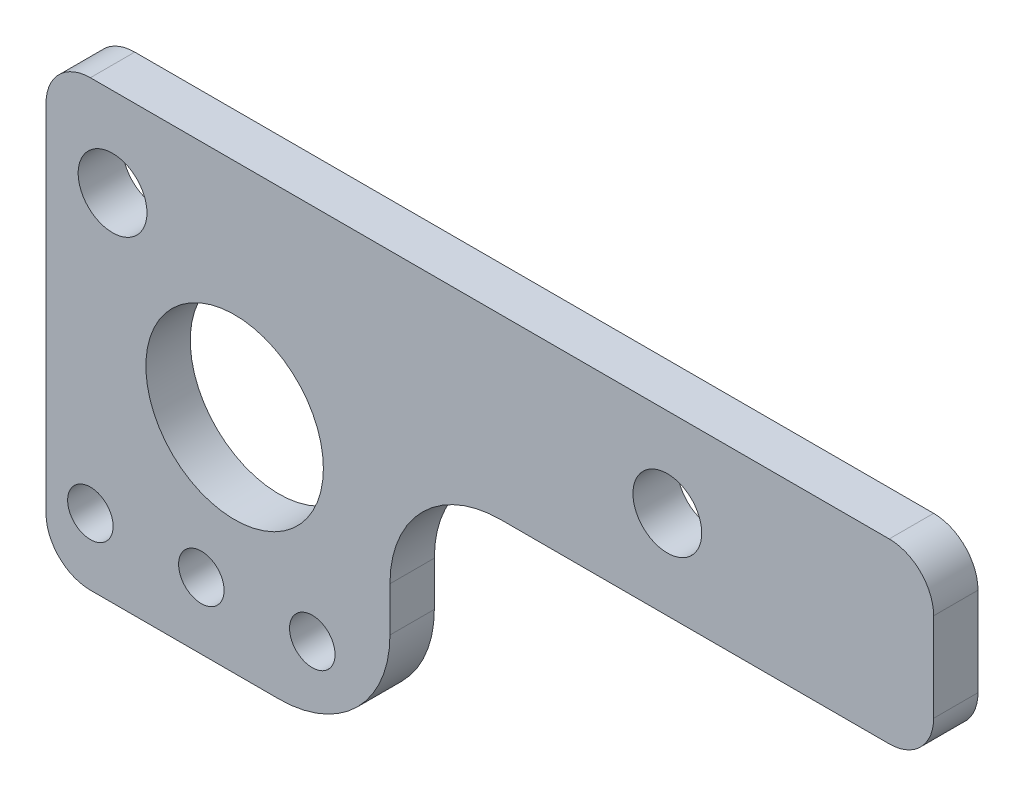
ISO-10303-21;
HEADER;
FILE_DESCRIPTION(('STEP AP214'),'2;1');
FILE_NAME('part.step','',(''),(''),'','','');
FILE_SCHEMA(('AUTOMOTIVE_DESIGN { 1 0 10303 214 1 1 1 1 }'));
ENDSEC;
DATA;
#1=APPLICATION_CONTEXT('core data for automotive mechanical design processes');
#2=APPLICATION_PROTOCOL_DEFINITION('international standard','automotive_design',2000,#1);
#3=PRODUCT_CONTEXT('',#1,'mechanical');
#4=PRODUCT('Part','Part','',(#3));
#5=PRODUCT_RELATED_PRODUCT_CATEGORY('part','',(#4));
#6=PRODUCT_DEFINITION_FORMATION('','',#4);
#7=PRODUCT_DEFINITION_CONTEXT('part definition',#1,'design');
#8=PRODUCT_DEFINITION('design','',#6,#7);
#9=PRODUCT_DEFINITION_SHAPE('','',#8);
#10=(LENGTH_UNIT() NAMED_UNIT(*) SI_UNIT(.MILLI.,.METRE.));
#11=(NAMED_UNIT(*) PLANE_ANGLE_UNIT() SI_UNIT($,.RADIAN.));
#12=(NAMED_UNIT(*) SI_UNIT($,.STERADIAN.) SOLID_ANGLE_UNIT());
#13=UNCERTAINTY_MEASURE_WITH_UNIT(LENGTH_MEASURE(1.E-05),#10,'distance_accuracy_value','');
#14=(GEOMETRIC_REPRESENTATION_CONTEXT(3) GLOBAL_UNCERTAINTY_ASSIGNED_CONTEXT((#13)) GLOBAL_UNIT_ASSIGNED_CONTEXT((#10,
#11,#12)) REPRESENTATION_CONTEXT('',''));
#15=CARTESIAN_POINT('',(0.,0.,0.));
#16=DIRECTION('',(0.,0.,1.));
#17=DIRECTION('',(1.,0.,0.));
#18=AXIS2_PLACEMENT_3D('',#15,#16,#17);
#19=CARTESIAN_POINT('',(-15.5,-4.,2.));
#20=DIRECTION('',(0.,1.,0.));
#21=DIRECTION('',(-1.,0.,0.));
#22=AXIS2_PLACEMENT_3D('',#19,#20,#21);
#23=PLANE('',#22);
#24=DIRECTION('',(1.,0.,0.));
#25=VECTOR('',#24,1.);
#26=CARTESIAN_POINT('',(-15.5,-4.,2.));
#27=LINE('',#26,#25);
#28=CARTESIAN_POINT('',(5.,-4.,2.));
#29=VERTEX_POINT('',#28);
#30=CARTESIAN_POINT('',(22.5,-4.,2.));
#31=VERTEX_POINT('',#30);
#32=EDGE_CURVE('E252',#29,#31,#27,.T.);
#33=ORIENTED_EDGE('',*,*,#32,.F.);
#34=DIRECTION('',(0.,0.,1.));
#35=VECTOR('',#34,1.);
#36=CARTESIAN_POINT('',(5.,-4.,2.));
#37=LINE('',#36,#35);
#38=CARTESIAN_POINT('',(5.,-4.,0.));
#39=VERTEX_POINT('',#38);
#40=EDGE_CURVE('E54',#29,#39,#37,.F.);
#41=ORIENTED_EDGE('',*,*,#40,.T.);
#42=DIRECTION('',(1.,0.,0.));
#43=VECTOR('',#42,1.);
#44=CARTESIAN_POINT('',(-15.5,-4.,0.));
#45=LINE('',#44,#43);
#46=CARTESIAN_POINT('',(22.5,-4.,0.));
#47=VERTEX_POINT('',#46);
#48=EDGE_CURVE('E178',#39,#47,#45,.T.);
#49=ORIENTED_EDGE('',*,*,#48,.T.);
#50=DIRECTION('',(0.,0.,1.));
#51=VECTOR('',#50,1.);
#52=CARTESIAN_POINT('',(22.5,-4.,2.));
#53=LINE('',#52,#51);
#54=EDGE_CURVE('E185',#47,#31,#53,.T.);
#55=ORIENTED_EDGE('',*,*,#54,.T.);
#56=EDGE_LOOP('',(#33,#41,#49,#55));
#57=FACE_BOUND('',#56,.T.);
#58=ADVANCED_FACE('F39',(#57),#23,.F.);
#59=CARTESIAN_POINT('',(-15.5,4.,2.));
#60=DIRECTION('',(0.,-1.,0.));
#61=DIRECTION('',(1.,0.,0.));
#62=AXIS2_PLACEMENT_3D('',#59,#60,#61);
#63=PLANE('',#62);
#64=DIRECTION('',(-1.,0.,0.));
#65=VECTOR('',#64,1.);
#66=CARTESIAN_POINT('',(-15.5,4.,2.));
#67=LINE('',#66,#65);
#68=CARTESIAN_POINT('',(22.5,4.,2.));
#69=VERTEX_POINT('',#68);
#70=CARTESIAN_POINT('',(-13.5,4.,2.));
#71=VERTEX_POINT('',#70);
#72=EDGE_CURVE('E184',#69,#71,#67,.T.);
#73=ORIENTED_EDGE('',*,*,#72,.F.);
#74=DIRECTION('',(0.,0.,1.));
#75=VECTOR('',#74,1.);
#76=CARTESIAN_POINT('',(22.5,4.,0.));
#77=LINE('',#76,#75);
#78=CARTESIAN_POINT('',(22.5,4.,0.));
#79=VERTEX_POINT('',#78);
#80=EDGE_CURVE('E272',#69,#79,#77,.F.);
#81=ORIENTED_EDGE('',*,*,#80,.T.);
#82=DIRECTION('',(-1.,0.,0.));
#83=VECTOR('',#82,1.);
#84=CARTESIAN_POINT('',(-15.5,4.,0.));
#85=LINE('',#84,#83);
#86=CARTESIAN_POINT('',(-13.5,4.,0.));
#87=VERTEX_POINT('',#86);
#88=EDGE_CURVE('E179',#79,#87,#85,.T.);
#89=ORIENTED_EDGE('',*,*,#88,.T.);
#90=DIRECTION('',(0.,0.,-1.));
#91=VECTOR('',#90,1.);
#92=CARTESIAN_POINT('',(-13.5,4.,2.));
#93=LINE('',#92,#91);
#94=EDGE_CURVE('E274',#87,#71,#93,.F.);
#95=ORIENTED_EDGE('',*,*,#94,.T.);
#96=EDGE_LOOP('',(#73,#81,#89,#95));
#97=FACE_BOUND('',#96,.T.);
#98=ADVANCED_FACE('F312',(#97),#63,.F.);
#99=CARTESIAN_POINT('',(-15.5,-4.,2.));
#100=DIRECTION('',(1.,0.,0.));
#101=DIRECTION('',(0.,0.,-1.));
#102=AXIS2_PLACEMENT_3D('',#99,#100,#101);
#103=PLANE('',#102);
#104=DIRECTION('',(0.,-1.,0.));
#105=VECTOR('',#104,1.);
#106=CARTESIAN_POINT('',(-15.5,-4.,0.));
#107=LINE('',#106,#105);
#108=CARTESIAN_POINT('',(-15.5,2.,0.));
#109=VERTEX_POINT('',#108);
#110=CARTESIAN_POINT('',(-15.5,-14.,0.));
#111=VERTEX_POINT('',#110);
#112=EDGE_CURVE('E174',#109,#111,#107,.T.);
#113=ORIENTED_EDGE('',*,*,#112,.T.);
#114=DIRECTION('',(0.,0.,1.));
#115=VECTOR('',#114,1.);
#116=CARTESIAN_POINT('',(-15.5,-14.,2.));
#117=LINE('',#116,#115);
#118=CARTESIAN_POINT('',(-15.5,-14.,2.));
#119=VERTEX_POINT('',#118);
#120=EDGE_CURVE('E154',#111,#119,#117,.T.);
#121=ORIENTED_EDGE('',*,*,#120,.T.);
#122=DIRECTION('',(0.,-1.,0.));
#123=VECTOR('',#122,1.);
#124=CARTESIAN_POINT('',(-15.5,-4.,2.));
#125=LINE('',#124,#123);
#126=CARTESIAN_POINT('',(-15.5,2.,2.));
#127=VERTEX_POINT('',#126);
#128=EDGE_CURVE('E260',#127,#119,#125,.T.);
#129=ORIENTED_EDGE('',*,*,#128,.F.);
#130=DIRECTION('',(0.,0.,-1.));
#131=VECTOR('',#130,1.);
#132=CARTESIAN_POINT('',(-15.5,2.,2.));
#133=LINE('',#132,#131);
#134=EDGE_CURVE('E269',#127,#109,#133,.T.);
#135=ORIENTED_EDGE('',*,*,#134,.T.);
#136=EDGE_LOOP('',(#113,#121,#129,#135));
#137=FACE_BOUND('',#136,.T.);
#138=ADVANCED_FACE('F303',(#137),#103,.F.);
#139=CARTESIAN_POINT('',(0.,0.,2.));
#140=DIRECTION('',(0.,0.,-1.));
#141=DIRECTION('',(-1.,0.,0.));
#142=AXIS2_PLACEMENT_3D('',#139,#140,#141);
#143=PLANE('',#142);
#144=CARTESIAN_POINT('',(-7.,-6.,2.));
#145=DIRECTION('',(0.,0.,1.));
#146=DIRECTION('',(1.,0.,0.));
#147=AXIS2_PLACEMENT_3D('',#144,#145,#146);
#148=CIRCLE('',#147,4.);
#149=CARTESIAN_POINT('',(-3.,-6.,2.));
#150=VERTEX_POINT('',#149);
#151=EDGE_CURVE('E226',#150,#150,#148,.T.);
#152=ORIENTED_EDGE('',*,*,#151,.F.);
#153=EDGE_LOOP('',(#152));
#154=FACE_BOUND('',#153,.T.);
#155=DIRECTION('',(1.,0.,0.));
#156=VECTOR('',#155,1.);
#157=CARTESIAN_POINT('',(0.,-16.,2.));
#158=LINE('',#157,#156);
#159=CARTESIAN_POINT('',(-13.5,-16.,2.));
#160=VERTEX_POINT('',#159);
#161=CARTESIAN_POINT('',(-5.,-16.,2.));
#162=VERTEX_POINT('',#161);
#163=EDGE_CURVE('E135',#160,#162,#158,.T.);
#164=ORIENTED_EDGE('',*,*,#163,.T.);
#165=CARTESIAN_POINT('',(-5.,-11.,2.));
#166=DIRECTION('',(0.,0.,-1.));
#167=DIRECTION('',(-1.,0.,0.));
#168=AXIS2_PLACEMENT_3D('',#165,#166,#167);
#169=CIRCLE('',#168,5.);
#170=CARTESIAN_POINT('',(0.,-11.,2.));
#171=VERTEX_POINT('',#170);
#172=EDGE_CURVE('E263',#162,#171,#169,.F.);
#173=ORIENTED_EDGE('',*,*,#172,.T.);
#174=DIRECTION('',(0.,1.,0.));
#175=VECTOR('',#174,1.);
#176=CARTESIAN_POINT('',(0.,-4.,2.));
#177=LINE('',#176,#175);
#178=CARTESIAN_POINT('',(0.,-9.,2.));
#179=VERTEX_POINT('',#178);
#180=EDGE_CURVE('E149',#171,#179,#177,.T.);
#181=ORIENTED_EDGE('',*,*,#180,.T.);
#182=CARTESIAN_POINT('',(5.,-9.,2.));
#183=DIRECTION('',(0.,0.,-1.));
#184=DIRECTION('',(-1.,0.,0.));
#185=AXIS2_PLACEMENT_3D('',#182,#183,#184);
#186=CIRCLE('',#185,5.);
#187=EDGE_CURVE('E47',#179,#29,#186,.T.);
#188=ORIENTED_EDGE('',*,*,#187,.T.);
#189=ORIENTED_EDGE('',*,*,#32,.T.);
#190=CARTESIAN_POINT('',(22.5,-2.,2.));
#191=DIRECTION('',(0.,0.,-1.));
#192=DIRECTION('',(-1.,0.,0.));
#193=AXIS2_PLACEMENT_3D('',#190,#191,#192);
#194=CIRCLE('',#193,2.);
#195=CARTESIAN_POINT('',(24.5,-2.,2.));
#196=VERTEX_POINT('',#195);
#197=EDGE_CURVE('E283',#31,#196,#194,.F.);
#198=ORIENTED_EDGE('',*,*,#197,.T.);
#199=DIRECTION('',(0.,1.,0.));
#200=VECTOR('',#199,1.);
#201=CARTESIAN_POINT('',(24.5,4.,2.));
#202=LINE('',#201,#200);
#203=CARTESIAN_POINT('',(24.5,2.,2.));
#204=VERTEX_POINT('',#203);
#205=EDGE_CURVE('E139',#196,#204,#202,.T.);
#206=ORIENTED_EDGE('',*,*,#205,.T.);
#207=CARTESIAN_POINT('',(22.5,2.,2.));
#208=DIRECTION('',(0.,0.,-1.));
#209=DIRECTION('',(-1.,0.,0.));
#210=AXIS2_PLACEMENT_3D('',#207,#208,#209);
#211=CIRCLE('',#210,2.);
#212=EDGE_CURVE('E290',#204,#69,#211,.F.);
#213=ORIENTED_EDGE('',*,*,#212,.T.);
#214=ORIENTED_EDGE('',*,*,#72,.T.);
#215=CARTESIAN_POINT('',(-13.5,2.,2.));
#216=DIRECTION('',(0.,0.,-1.));
#217=DIRECTION('',(-1.,0.,0.));
#218=AXIS2_PLACEMENT_3D('',#215,#216,#217);
#219=CIRCLE('',#218,2.);
#220=EDGE_CURVE('E284',#71,#127,#219,.F.);
#221=ORIENTED_EDGE('',*,*,#220,.T.);
#222=ORIENTED_EDGE('',*,*,#128,.T.);
#223=CARTESIAN_POINT('',(-13.5,-14.,2.));
#224=DIRECTION('',(0.,0.,-1.));
#225=DIRECTION('',(-1.,0.,0.));
#226=AXIS2_PLACEMENT_3D('',#223,#224,#225);
#227=CIRCLE('',#226,2.);
#228=EDGE_CURVE('E285',#119,#160,#227,.F.);
#229=ORIENTED_EDGE('',*,*,#228,.T.);
#230=EDGE_LOOP('',(#164,#173,#181,#188,#189,#198,#206,#213,#214,#221,#222,#229));
#231=FACE_BOUND('',#230,.T.);
#232=CARTESIAN_POINT('',(-13.5,-13.,2.));
#233=DIRECTION('',(0.,0.,1.));
#234=DIRECTION('',(1.,0.,0.));
#235=AXIS2_PLACEMENT_3D('',#232,#233,#234);
#236=CIRCLE('',#235,1.025);
#237=CARTESIAN_POINT('',(-12.475,-13.,2.));
#238=VERTEX_POINT('',#237);
#239=EDGE_CURVE('E201',#238,#238,#236,.T.);
#240=ORIENTED_EDGE('',*,*,#239,.F.);
#241=EDGE_LOOP('',(#240));
#242=FACE_BOUND('',#241,.T.);
#243=CARTESIAN_POINT('',(12.5,0.,2.));
#244=DIRECTION('',(0.,0.,1.));
#245=DIRECTION('',(1.,0.,0.));
#246=AXIS2_PLACEMENT_3D('',#243,#244,#245);
#247=CIRCLE('',#246,1.55);
#248=CARTESIAN_POINT('',(14.05,0.,2.));
#249=VERTEX_POINT('',#248);
#250=EDGE_CURVE('E210',#249,#249,#247,.T.);
#251=ORIENTED_EDGE('',*,*,#250,.F.);
#252=EDGE_LOOP('',(#251));
#253=FACE_BOUND('',#252,.T.);
#254=CARTESIAN_POINT('',(-12.5,0.,2.));
#255=DIRECTION('',(0.,0.,1.));
#256=DIRECTION('',(1.,0.,0.));
#257=AXIS2_PLACEMENT_3D('',#254,#255,#256);
#258=CIRCLE('',#257,1.55);
#259=CARTESIAN_POINT('',(-10.95,0.,2.));
#260=VERTEX_POINT('',#259);
#261=EDGE_CURVE('E200',#260,#260,#258,.T.);
#262=ORIENTED_EDGE('',*,*,#261,.F.);
#263=EDGE_LOOP('',(#262));
#264=FACE_BOUND('',#263,.T.);
#265=CARTESIAN_POINT('',(-3.5,-13.,2.));
#266=DIRECTION('',(0.,0.,1.));
#267=DIRECTION('',(1.,0.,0.));
#268=AXIS2_PLACEMENT_3D('',#265,#266,#267);
#269=CIRCLE('',#268,1.025);
#270=CARTESIAN_POINT('',(-2.475,-13.,2.));
#271=VERTEX_POINT('',#270);
#272=EDGE_CURVE('E225',#271,#271,#269,.T.);
#273=ORIENTED_EDGE('',*,*,#272,.F.);
#274=EDGE_LOOP('',(#273));
#275=FACE_BOUND('',#274,.T.);
#276=CARTESIAN_POINT('',(-8.5,-13.,2.));
#277=DIRECTION('',(0.,0.,1.));
#278=DIRECTION('',(1.,0.,0.));
#279=AXIS2_PLACEMENT_3D('',#276,#277,#278);
#280=CIRCLE('',#279,1.025);
#281=CARTESIAN_POINT('',(-7.475,-13.,2.));
#282=VERTEX_POINT('',#281);
#283=EDGE_CURVE('E224',#282,#282,#280,.T.);
#284=ORIENTED_EDGE('',*,*,#283,.F.);
#285=EDGE_LOOP('',(#284));
#286=FACE_BOUND('',#285,.T.);
#287=ADVANCED_FACE('F250',(#154,#231,#242,#253,#264,#275,#286),#143,.F.);
#288=CARTESIAN_POINT('',(0.,0.,0.));
#289=DIRECTION('',(0.,0.,-1.));
#290=DIRECTION('',(-1.,0.,0.));
#291=AXIS2_PLACEMENT_3D('',#288,#289,#290);
#292=PLANE('',#291);
#293=CARTESIAN_POINT('',(-7.,-6.,0.));
#294=DIRECTION('',(0.,0.,1.));
#295=DIRECTION('',(1.,0.,0.));
#296=AXIS2_PLACEMENT_3D('',#293,#294,#295);
#297=CIRCLE('',#296,4.);
#298=CARTESIAN_POINT('',(-3.,-6.,0.));
#299=VERTEX_POINT('',#298);
#300=EDGE_CURVE('E229',#299,#299,#297,.T.);
#301=ORIENTED_EDGE('',*,*,#300,.T.);
#302=EDGE_LOOP('',(#301));
#303=FACE_BOUND('',#302,.T.);
#304=DIRECTION('',(0.,1.,0.));
#305=VECTOR('',#304,1.);
#306=CARTESIAN_POINT('',(0.,-4.,0.));
#307=LINE('',#306,#305);
#308=CARTESIAN_POINT('',(0.,-11.,0.));
#309=VERTEX_POINT('',#308);
#310=CARTESIAN_POINT('',(0.,-9.,0.));
#311=VERTEX_POINT('',#310);
#312=EDGE_CURVE('E140',#309,#311,#307,.T.);
#313=ORIENTED_EDGE('',*,*,#312,.F.);
#314=CARTESIAN_POINT('',(-5.,-11.,0.));
#315=DIRECTION('',(0.,0.,-1.));
#316=DIRECTION('',(-1.,0.,0.));
#317=AXIS2_PLACEMENT_3D('',#314,#315,#316);
#318=CIRCLE('',#317,5.);
#319=CARTESIAN_POINT('',(-5.,-16.,0.));
#320=VERTEX_POINT('',#319);
#321=EDGE_CURVE('E148',#309,#320,#318,.T.);
#322=ORIENTED_EDGE('',*,*,#321,.T.);
#323=DIRECTION('',(1.,0.,0.));
#324=VECTOR('',#323,1.);
#325=CARTESIAN_POINT('',(0.,-16.,0.));
#326=LINE('',#325,#324);
#327=CARTESIAN_POINT('',(-13.5,-16.,0.));
#328=VERTEX_POINT('',#327);
#329=EDGE_CURVE('E132',#328,#320,#326,.T.);
#330=ORIENTED_EDGE('',*,*,#329,.F.);
#331=CARTESIAN_POINT('',(-13.5,-14.,0.));
#332=DIRECTION('',(0.,0.,-1.));
#333=DIRECTION('',(-1.,0.,0.));
#334=AXIS2_PLACEMENT_3D('',#331,#332,#333);
#335=CIRCLE('',#334,2.);
#336=EDGE_CURVE('E145',#328,#111,#335,.T.);
#337=ORIENTED_EDGE('',*,*,#336,.T.);
#338=ORIENTED_EDGE('',*,*,#112,.F.);
#339=CARTESIAN_POINT('',(-13.5,2.,0.));
#340=DIRECTION('',(0.,0.,-1.));
#341=DIRECTION('',(-1.,0.,0.));
#342=AXIS2_PLACEMENT_3D('',#339,#340,#341);
#343=CIRCLE('',#342,2.);
#344=EDGE_CURVE('E156',#109,#87,#343,.T.);
#345=ORIENTED_EDGE('',*,*,#344,.T.);
#346=ORIENTED_EDGE('',*,*,#88,.F.);
#347=CARTESIAN_POINT('',(22.5,2.,0.));
#348=DIRECTION('',(0.,0.,-1.));
#349=DIRECTION('',(-1.,0.,0.));
#350=AXIS2_PLACEMENT_3D('',#347,#348,#349);
#351=CIRCLE('',#350,2.);
#352=CARTESIAN_POINT('',(24.5,2.,0.));
#353=VERTEX_POINT('',#352);
#354=EDGE_CURVE('E155',#79,#353,#351,.T.);
#355=ORIENTED_EDGE('',*,*,#354,.T.);
#356=DIRECTION('',(0.,1.,0.));
#357=VECTOR('',#356,1.);
#358=CARTESIAN_POINT('',(24.5,4.,0.));
#359=LINE('',#358,#357);
#360=CARTESIAN_POINT('',(24.5,-2.,0.));
#361=VERTEX_POINT('',#360);
#362=EDGE_CURVE('E202',#361,#353,#359,.T.);
#363=ORIENTED_EDGE('',*,*,#362,.F.);
#364=CARTESIAN_POINT('',(22.5,-2.,0.));
#365=DIRECTION('',(0.,0.,-1.));
#366=DIRECTION('',(-1.,0.,0.));
#367=AXIS2_PLACEMENT_3D('',#364,#365,#366);
#368=CIRCLE('',#367,2.);
#369=EDGE_CURVE('E158',#361,#47,#368,.T.);
#370=ORIENTED_EDGE('',*,*,#369,.T.);
#371=ORIENTED_EDGE('',*,*,#48,.F.);
#372=CARTESIAN_POINT('',(5.,-9.,0.));
#373=DIRECTION('',(0.,0.,-1.));
#374=DIRECTION('',(-1.,0.,0.));
#375=AXIS2_PLACEMENT_3D('',#372,#373,#374);
#376=CIRCLE('',#375,5.);
#377=EDGE_CURVE('E12',#39,#311,#376,.F.);
#378=ORIENTED_EDGE('',*,*,#377,.T.);
#379=EDGE_LOOP('',(#313,#322,#330,#337,#338,#345,#346,#355,#363,#370,#371,#378));
#380=FACE_BOUND('',#379,.T.);
#381=CARTESIAN_POINT('',(-13.5,-13.,0.));
#382=DIRECTION('',(0.,0.,1.));
#383=DIRECTION('',(1.,0.,0.));
#384=AXIS2_PLACEMENT_3D('',#381,#382,#383);
#385=CIRCLE('',#384,1.025);
#386=CARTESIAN_POINT('',(-12.475,-13.,0.));
#387=VERTEX_POINT('',#386);
#388=EDGE_CURVE('E195',#387,#387,#385,.T.);
#389=ORIENTED_EDGE('',*,*,#388,.T.);
#390=EDGE_LOOP('',(#389));
#391=FACE_BOUND('',#390,.T.);
#392=CARTESIAN_POINT('',(12.5,0.,0.));
#393=DIRECTION('',(0.,0.,1.));
#394=DIRECTION('',(1.,0.,0.));
#395=AXIS2_PLACEMENT_3D('',#392,#393,#394);
#396=CIRCLE('',#395,1.55);
#397=CARTESIAN_POINT('',(14.05,0.,0.));
#398=VERTEX_POINT('',#397);
#399=EDGE_CURVE('E206',#398,#398,#396,.T.);
#400=ORIENTED_EDGE('',*,*,#399,.T.);
#401=EDGE_LOOP('',(#400));
#402=FACE_BOUND('',#401,.T.);
#403=CARTESIAN_POINT('',(-12.5,0.,0.));
#404=DIRECTION('',(0.,0.,1.));
#405=DIRECTION('',(1.,0.,0.));
#406=AXIS2_PLACEMENT_3D('',#403,#404,#405);
#407=CIRCLE('',#406,1.55);
#408=CARTESIAN_POINT('',(-10.95,0.,0.));
#409=VERTEX_POINT('',#408);
#410=EDGE_CURVE('E213',#409,#409,#407,.T.);
#411=ORIENTED_EDGE('',*,*,#410,.T.);
#412=EDGE_LOOP('',(#411));
#413=FACE_BOUND('',#412,.T.);
#414=CARTESIAN_POINT('',(-3.5,-13.,0.));
#415=DIRECTION('',(0.,0.,1.));
#416=DIRECTION('',(1.,0.,0.));
#417=AXIS2_PLACEMENT_3D('',#414,#415,#416);
#418=CIRCLE('',#417,1.025);
#419=CARTESIAN_POINT('',(-2.475,-13.,0.));
#420=VERTEX_POINT('',#419);
#421=EDGE_CURVE('E219',#420,#420,#418,.T.);
#422=ORIENTED_EDGE('',*,*,#421,.T.);
#423=EDGE_LOOP('',(#422));
#424=FACE_BOUND('',#423,.T.);
#425=CARTESIAN_POINT('',(-8.5,-13.,0.));
#426=DIRECTION('',(0.,0.,1.));
#427=DIRECTION('',(1.,0.,0.));
#428=AXIS2_PLACEMENT_3D('',#425,#426,#427);
#429=CIRCLE('',#428,1.025);
#430=CARTESIAN_POINT('',(-7.475,-13.,0.));
#431=VERTEX_POINT('',#430);
#432=EDGE_CURVE('E230',#431,#431,#429,.T.);
#433=ORIENTED_EDGE('',*,*,#432,.T.);
#434=EDGE_LOOP('',(#433));
#435=FACE_BOUND('',#434,.T.);
#436=ADVANCED_FACE('F142',(#303,#380,#391,#402,#413,#424,#435),#292,.T.);
#437=CARTESIAN_POINT('',(-12.5,0.,0.));
#438=DIRECTION('',(0.,0.,1.));
#439=DIRECTION('',(1.,0.,0.));
#440=AXIS2_PLACEMENT_3D('',#437,#438,#439);
#441=CYLINDRICAL_SURFACE('',#440,1.55);
#442=ORIENTED_EDGE('',*,*,#410,.F.);
#443=EDGE_LOOP('',(#442));
#444=FACE_BOUND('',#443,.T.);
#445=ORIENTED_EDGE('',*,*,#261,.T.);
#446=EDGE_LOOP('',(#445));
#447=FACE_BOUND('',#446,.T.);
#448=ADVANCED_FACE('F430',(#444,#447),#441,.F.);
#449=CARTESIAN_POINT('',(12.5,0.,0.));
#450=DIRECTION('',(0.,0.,1.));
#451=DIRECTION('',(1.,0.,0.));
#452=AXIS2_PLACEMENT_3D('',#449,#450,#451);
#453=CYLINDRICAL_SURFACE('',#452,1.55);
#454=ORIENTED_EDGE('',*,*,#399,.F.);
#455=EDGE_LOOP('',(#454));
#456=FACE_BOUND('',#455,.T.);
#457=ORIENTED_EDGE('',*,*,#250,.T.);
#458=EDGE_LOOP('',(#457));
#459=FACE_BOUND('',#458,.T.);
#460=ADVANCED_FACE('F450',(#456,#459),#453,.F.);
#461=CARTESIAN_POINT('',(-13.5,-13.,0.));
#462=DIRECTION('',(0.,0.,1.));
#463=DIRECTION('',(1.,0.,0.));
#464=AXIS2_PLACEMENT_3D('',#461,#462,#463);
#465=CYLINDRICAL_SURFACE('',#464,1.025);
#466=ORIENTED_EDGE('',*,*,#388,.F.);
#467=EDGE_LOOP('',(#466));
#468=FACE_BOUND('',#467,.T.);
#469=ORIENTED_EDGE('',*,*,#239,.T.);
#470=EDGE_LOOP('',(#469));
#471=FACE_BOUND('',#470,.T.);
#472=ADVANCED_FACE('F447',(#468,#471),#465,.F.);
#473=CARTESIAN_POINT('',(24.5,4.,-12.0415945787923));
#474=DIRECTION('',(1.,0.,0.));
#475=DIRECTION('',(0.,0.,-1.));
#476=AXIS2_PLACEMENT_3D('',#473,#474,#475);
#477=PLANE('',#476);
#478=ORIENTED_EDGE('',*,*,#205,.F.);
#479=DIRECTION('',(0.,0.,1.));
#480=VECTOR('',#479,1.);
#481=CARTESIAN_POINT('',(24.5,-2.,0.));
#482=LINE('',#481,#480);
#483=EDGE_CURVE('E160',#196,#361,#482,.F.);
#484=ORIENTED_EDGE('',*,*,#483,.T.);
#485=ORIENTED_EDGE('',*,*,#362,.T.);
#486=DIRECTION('',(0.,0.,1.));
#487=VECTOR('',#486,1.);
#488=CARTESIAN_POINT('',(24.5,2.,2.));
#489=LINE('',#488,#487);
#490=EDGE_CURVE('E295',#353,#204,#489,.T.);
#491=ORIENTED_EDGE('',*,*,#490,.T.);
#492=EDGE_LOOP('',(#478,#484,#485,#491));
#493=FACE_BOUND('',#492,.T.);
#494=ADVANCED_FACE('F299',(#493),#477,.T.);
#495=CARTESIAN_POINT('',(22.5,-2.,2.));
#496=DIRECTION('',(0.,0.,-1.));
#497=DIRECTION('',(-1.,0.,0.));
#498=AXIS2_PLACEMENT_3D('',#495,#496,#497);
#499=CYLINDRICAL_SURFACE('',#498,2.);
#500=ORIENTED_EDGE('',*,*,#369,.F.);
#501=ORIENTED_EDGE('',*,*,#483,.F.);
#502=ORIENTED_EDGE('',*,*,#197,.F.);
#503=ORIENTED_EDGE('',*,*,#54,.F.);
#504=EDGE_LOOP('',(#500,#501,#502,#503));
#505=FACE_BOUND('',#504,.T.);
#506=ADVANCED_FACE('F282',(#505),#499,.T.);
#507=CARTESIAN_POINT('',(22.5,2.,-12.0415945787923));
#508=DIRECTION('',(0.,0.,-1.));
#509=DIRECTION('',(-1.,0.,0.));
#510=AXIS2_PLACEMENT_3D('',#507,#508,#509);
#511=CYLINDRICAL_SURFACE('',#510,2.);
#512=ORIENTED_EDGE('',*,*,#354,.F.);
#513=ORIENTED_EDGE('',*,*,#80,.F.);
#514=ORIENTED_EDGE('',*,*,#212,.F.);
#515=ORIENTED_EDGE('',*,*,#490,.F.);
#516=EDGE_LOOP('',(#512,#513,#514,#515));
#517=FACE_BOUND('',#516,.T.);
#518=ADVANCED_FACE('F323',(#517),#511,.T.);
#519=CARTESIAN_POINT('',(-13.5,-14.,2.));
#520=DIRECTION('',(0.,0.,-1.));
#521=DIRECTION('',(-1.,0.,0.));
#522=AXIS2_PLACEMENT_3D('',#519,#520,#521);
#523=CYLINDRICAL_SURFACE('',#522,2.);
#524=ORIENTED_EDGE('',*,*,#336,.F.);
#525=DIRECTION('',(0.,0.,1.));
#526=VECTOR('',#525,1.);
#527=CARTESIAN_POINT('',(-13.5,-16.,-12.6491106406735));
#528=LINE('',#527,#526);
#529=EDGE_CURVE('E128',#328,#160,#528,.T.);
#530=ORIENTED_EDGE('',*,*,#529,.T.);
#531=ORIENTED_EDGE('',*,*,#228,.F.);
#532=ORIENTED_EDGE('',*,*,#120,.F.);
#533=EDGE_LOOP('',(#524,#530,#531,#532));
#534=FACE_BOUND('',#533,.T.);
#535=ADVANCED_FACE('F152',(#534),#523,.T.);
#536=CARTESIAN_POINT('',(-13.5,2.,2.));
#537=DIRECTION('',(0.,0.,-1.));
#538=DIRECTION('',(-1.,0.,0.));
#539=AXIS2_PLACEMENT_3D('',#536,#537,#538);
#540=CYLINDRICAL_SURFACE('',#539,2.);
#541=ORIENTED_EDGE('',*,*,#220,.F.);
#542=ORIENTED_EDGE('',*,*,#94,.F.);
#543=ORIENTED_EDGE('',*,*,#344,.F.);
#544=ORIENTED_EDGE('',*,*,#134,.F.);
#545=EDGE_LOOP('',(#541,#542,#543,#544));
#546=FACE_BOUND('',#545,.T.);
#547=ADVANCED_FACE('F314',(#546),#540,.T.);
#548=CARTESIAN_POINT('',(0.,-4.,0.));
#549=DIRECTION('',(1.,0.,0.));
#550=DIRECTION('',(0.,1.,0.));
#551=AXIS2_PLACEMENT_3D('',#548,#549,#550);
#552=PLANE('',#551);
#553=ORIENTED_EDGE('',*,*,#180,.F.);
#554=DIRECTION('',(0.,0.,1.));
#555=VECTOR('',#554,1.);
#556=CARTESIAN_POINT('',(0.,-11.,0.));
#557=LINE('',#556,#555);
#558=EDGE_CURVE('E246',#171,#309,#557,.F.);
#559=ORIENTED_EDGE('',*,*,#558,.T.);
#560=ORIENTED_EDGE('',*,*,#312,.T.);
#561=DIRECTION('',(0.,0.,1.));
#562=VECTOR('',#561,1.);
#563=CARTESIAN_POINT('',(0.,-9.,0.));
#564=LINE('',#563,#562);
#565=EDGE_CURVE('E261',#311,#179,#564,.T.);
#566=ORIENTED_EDGE('',*,*,#565,.T.);
#567=EDGE_LOOP('',(#553,#559,#560,#566));
#568=FACE_BOUND('',#567,.T.);
#569=ADVANCED_FACE('F316',(#568),#552,.T.);
#570=CARTESIAN_POINT('',(0.,-16.,0.));
#571=DIRECTION('',(0.,-1.,0.));
#572=DIRECTION('',(0.,0.,-1.));
#573=AXIS2_PLACEMENT_3D('',#570,#571,#572);
#574=PLANE('',#573);
#575=ORIENTED_EDGE('',*,*,#329,.T.);
#576=DIRECTION('',(0.,0.,1.));
#577=VECTOR('',#576,1.);
#578=CARTESIAN_POINT('',(-5.,-16.,0.));
#579=LINE('',#578,#577);
#580=EDGE_CURVE('E264',#320,#162,#579,.T.);
#581=ORIENTED_EDGE('',*,*,#580,.T.);
#582=ORIENTED_EDGE('',*,*,#163,.F.);
#583=ORIENTED_EDGE('',*,*,#529,.F.);
#584=EDGE_LOOP('',(#575,#581,#582,#583));
#585=FACE_BOUND('',#584,.T.);
#586=ADVANCED_FACE('F130',(#585),#574,.T.);
#587=CARTESIAN_POINT('',(-8.5,-13.,0.));
#588=DIRECTION('',(0.,0.,1.));
#589=DIRECTION('',(1.,0.,0.));
#590=AXIS2_PLACEMENT_3D('',#587,#588,#589);
#591=CYLINDRICAL_SURFACE('',#590,1.025);
#592=ORIENTED_EDGE('',*,*,#432,.F.);
#593=EDGE_LOOP('',(#592));
#594=FACE_BOUND('',#593,.T.);
#595=ORIENTED_EDGE('',*,*,#283,.T.);
#596=EDGE_LOOP('',(#595));
#597=FACE_BOUND('',#596,.T.);
#598=ADVANCED_FACE('F357',(#594,#597),#591,.F.);
#599=CARTESIAN_POINT('',(-3.5,-13.,0.));
#600=DIRECTION('',(0.,0.,1.));
#601=DIRECTION('',(1.,0.,0.));
#602=AXIS2_PLACEMENT_3D('',#599,#600,#601);
#603=CYLINDRICAL_SURFACE('',#602,1.025);
#604=ORIENTED_EDGE('',*,*,#421,.F.);
#605=EDGE_LOOP('',(#604));
#606=FACE_BOUND('',#605,.T.);
#607=ORIENTED_EDGE('',*,*,#272,.T.);
#608=EDGE_LOOP('',(#607));
#609=FACE_BOUND('',#608,.T.);
#610=ADVANCED_FACE('F362',(#606,#609),#603,.F.);
#611=CARTESIAN_POINT('',(-5.,-11.,0.));
#612=DIRECTION('',(0.,0.,1.));
#613=DIRECTION('',(1.,0.,0.));
#614=AXIS2_PLACEMENT_3D('',#611,#612,#613);
#615=CYLINDRICAL_SURFACE('',#614,5.);
#616=ORIENTED_EDGE('',*,*,#321,.F.);
#617=ORIENTED_EDGE('',*,*,#558,.F.);
#618=ORIENTED_EDGE('',*,*,#172,.F.);
#619=ORIENTED_EDGE('',*,*,#580,.F.);
#620=EDGE_LOOP('',(#616,#617,#618,#619));
#621=FACE_BOUND('',#620,.T.);
#622=ADVANCED_FACE('F373',(#621),#615,.T.);
#623=CARTESIAN_POINT('',(5.,-9.,0.));
#624=DIRECTION('',(0.,0.,1.));
#625=DIRECTION('',(1.,0.,0.));
#626=AXIS2_PLACEMENT_3D('',#623,#624,#625);
#627=CYLINDRICAL_SURFACE('',#626,5.);
#628=ORIENTED_EDGE('',*,*,#377,.F.);
#629=ORIENTED_EDGE('',*,*,#40,.F.);
#630=ORIENTED_EDGE('',*,*,#187,.F.);
#631=ORIENTED_EDGE('',*,*,#565,.F.);
#632=EDGE_LOOP('',(#628,#629,#630,#631));
#633=FACE_BOUND('',#632,.T.);
#634=ADVANCED_FACE('F41',(#633),#627,.F.);
#635=CARTESIAN_POINT('',(-7.,-6.,0.));
#636=DIRECTION('',(0.,0.,1.));
#637=DIRECTION('',(1.,0.,0.));
#638=AXIS2_PLACEMENT_3D('',#635,#636,#637);
#639=CYLINDRICAL_SURFACE('',#638,4.);
#640=ORIENTED_EDGE('',*,*,#300,.F.);
#641=EDGE_LOOP('',(#640));
#642=FACE_BOUND('',#641,.T.);
#643=ORIENTED_EDGE('',*,*,#151,.T.);
#644=EDGE_LOOP('',(#643));
#645=FACE_BOUND('',#644,.T.);
#646=ADVANCED_FACE('F412',(#642,#645),#639,.F.);
#647=CLOSED_SHELL('',(#58,#98,#138,#287,#436,#448,#460,#472,#494,#506,#518,#535,#547,#569,#586,
#598,#610,#622,#634,#646));
#648=MANIFOLD_SOLID_BREP('B2',#647);
#649=ADVANCED_BREP_SHAPE_REPRESENTATION('',(#18,#648),#14);
#650=SHAPE_DEFINITION_REPRESENTATION(#9,#649);
ENDSEC;
END-ISO-10303-21;
